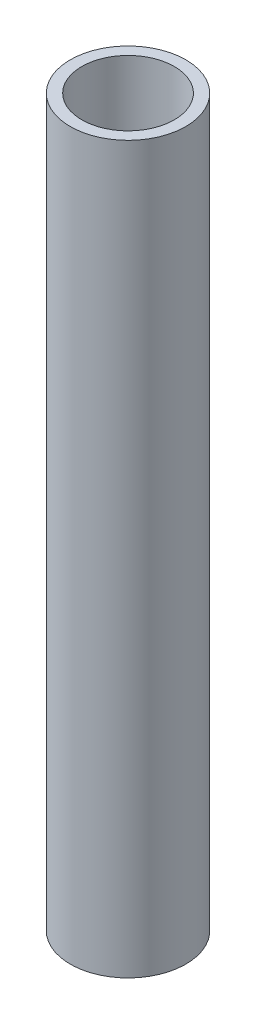
ISO-10303-21;
HEADER;
FILE_DESCRIPTION(('STEP AP214'),'2;1');
FILE_NAME('part.step','',(''),(''),'','','');
FILE_SCHEMA(('AUTOMOTIVE_DESIGN { 1 0 10303 214 1 1 1 1 }'));
ENDSEC;
DATA;
#1=APPLICATION_CONTEXT('core data for automotive mechanical design processes');
#2=APPLICATION_PROTOCOL_DEFINITION('international standard','automotive_design',2000,#1);
#3=PRODUCT_CONTEXT('',#1,'mechanical');
#4=PRODUCT('Part','Part','',(#3));
#5=PRODUCT_RELATED_PRODUCT_CATEGORY('part','',(#4));
#6=PRODUCT_DEFINITION_FORMATION('','',#4);
#7=PRODUCT_DEFINITION_CONTEXT('part definition',#1,'design');
#8=PRODUCT_DEFINITION('design','',#6,#7);
#9=PRODUCT_DEFINITION_SHAPE('','',#8);
#10=(LENGTH_UNIT() NAMED_UNIT(*) SI_UNIT(.MILLI.,.METRE.));
#11=(NAMED_UNIT(*) PLANE_ANGLE_UNIT() SI_UNIT($,.RADIAN.));
#12=(NAMED_UNIT(*) SI_UNIT($,.STERADIAN.) SOLID_ANGLE_UNIT());
#13=UNCERTAINTY_MEASURE_WITH_UNIT(LENGTH_MEASURE(1.E-05),#10,'distance_accuracy_value','');
#14=(GEOMETRIC_REPRESENTATION_CONTEXT(3) GLOBAL_UNCERTAINTY_ASSIGNED_CONTEXT((#13)) GLOBAL_UNIT_ASSIGNED_CONTEXT((#10,
#11,#12)) REPRESENTATION_CONTEXT('',''));
#15=CARTESIAN_POINT('',(0.,0.,0.));
#16=DIRECTION('',(0.,0.,1.));
#17=DIRECTION('',(1.,0.,0.));
#18=AXIS2_PLACEMENT_3D('',#15,#16,#17);
#19=CARTESIAN_POINT('',(0.,188.23,0.));
#20=DIRECTION('',(0.,1.,0.));
#21=DIRECTION('',(0.,0.,1.));
#22=AXIS2_PLACEMENT_3D('',#19,#20,#21);
#23=PLANE('',#22);
#24=CARTESIAN_POINT('',(0.,188.23,0.));
#25=DIRECTION('',(0.,1.,0.));
#26=DIRECTION('',(0.,0.,1.));
#27=AXIS2_PLACEMENT_3D('',#24,#25,#26);
#28=CIRCLE('',#27,15.);
#29=CARTESIAN_POINT('',(0.,188.23,-15.));
#30=VERTEX_POINT('',#29);
#31=EDGE_CURVE('E10',#30,#30,#28,.T.);
#32=ORIENTED_EDGE('',*,*,#31,.T.);
#33=EDGE_LOOP('',(#32));
#34=FACE_BOUND('',#33,.T.);
#35=CARTESIAN_POINT('',(0.,188.23,0.));
#36=DIRECTION('',(0.,1.,0.));
#37=DIRECTION('',(0.,0.,1.));
#38=AXIS2_PLACEMENT_3D('',#35,#36,#37);
#39=CIRCLE('',#38,12.);
#40=CARTESIAN_POINT('',(0.,188.23,-12.));
#41=VERTEX_POINT('',#40);
#42=EDGE_CURVE('E43',#41,#41,#39,.T.);
#43=ORIENTED_EDGE('',*,*,#42,.F.);
#44=EDGE_LOOP('',(#43));
#45=FACE_BOUND('',#44,.T.);
#46=ADVANCED_FACE('F32',(#34,#45),#23,.T.);
#47=CARTESIAN_POINT('',(0.,0.,0.));
#48=DIRECTION('',(0.,1.,0.));
#49=DIRECTION('',(0.,0.,1.));
#50=AXIS2_PLACEMENT_3D('',#47,#48,#49);
#51=PLANE('',#50);
#52=CARTESIAN_POINT('',(0.,0.,0.));
#53=DIRECTION('',(0.,1.,0.));
#54=DIRECTION('',(0.,0.,1.));
#55=AXIS2_PLACEMENT_3D('',#52,#53,#54);
#56=CIRCLE('',#55,15.);
#57=CARTESIAN_POINT('',(0.,0.,-15.));
#58=VERTEX_POINT('',#57);
#59=EDGE_CURVE('E36',#58,#58,#56,.T.);
#60=ORIENTED_EDGE('',*,*,#59,.F.);
#61=EDGE_LOOP('',(#60));
#62=FACE_BOUND('',#61,.T.);
#63=CARTESIAN_POINT('',(0.,0.,0.));
#64=DIRECTION('',(0.,1.,0.));
#65=DIRECTION('',(0.,0.,1.));
#66=AXIS2_PLACEMENT_3D('',#63,#64,#65);
#67=CIRCLE('',#66,12.);
#68=CARTESIAN_POINT('',(0.,0.,-12.));
#69=VERTEX_POINT('',#68);
#70=EDGE_CURVE('E45',#69,#69,#67,.T.);
#71=ORIENTED_EDGE('',*,*,#70,.T.);
#72=EDGE_LOOP('',(#71));
#73=FACE_BOUND('',#72,.T.);
#74=ADVANCED_FACE('F55',(#62,#73),#51,.F.);
#75=CARTESIAN_POINT('',(0.,188.23,0.));
#76=DIRECTION('',(0.,-1.,0.));
#77=DIRECTION('',(0.,0.,-1.));
#78=AXIS2_PLACEMENT_3D('',#75,#76,#77);
#79=CYLINDRICAL_SURFACE('',#78,15.);
#80=CARTESIAN_POINT('',(0.,188.23,-15.));
#81=CARTESIAN_POINT('',(0.,186.269270833333,-15.));
#82=CARTESIAN_POINT('',(0.,184.308541666667,-15.));
#83=CARTESIAN_POINT('',(0.,180.387083333333,-15.));
#84=CARTESIAN_POINT('',(0.,178.426354166667,-15.));
#85=CARTESIAN_POINT('',(0.,174.504895833333,-15.));
#86=CARTESIAN_POINT('',(0.,172.544166666667,-15.));
#87=CARTESIAN_POINT('',(0.,168.622708333333,-15.));
#88=CARTESIAN_POINT('',(0.,166.661979166667,-15.));
#89=CARTESIAN_POINT('',(0.,162.740520833333,-15.));
#90=CARTESIAN_POINT('',(0.,160.779791666667,-15.));
#91=CARTESIAN_POINT('',(0.,156.858333333333,-15.));
#92=CARTESIAN_POINT('',(0.,154.897604166667,-15.));
#93=CARTESIAN_POINT('',(0.,150.976145833333,-15.));
#94=CARTESIAN_POINT('',(0.,149.015416666667,-15.));
#95=CARTESIAN_POINT('',(0.,145.093958333333,-15.));
#96=CARTESIAN_POINT('',(0.,143.133229166667,-15.));
#97=CARTESIAN_POINT('',(0.,139.211770833333,-15.));
#98=CARTESIAN_POINT('',(0.,137.251041666667,-15.));
#99=CARTESIAN_POINT('',(0.,133.329583333333,-15.));
#100=CARTESIAN_POINT('',(0.,131.368854166667,-15.));
#101=CARTESIAN_POINT('',(0.,127.447395833333,-15.));
#102=CARTESIAN_POINT('',(0.,125.486666666667,-15.));
#103=CARTESIAN_POINT('',(0.,121.565208333333,-15.));
#104=CARTESIAN_POINT('',(0.,119.604479166667,-15.));
#105=CARTESIAN_POINT('',(0.,115.683020833333,-15.));
#106=CARTESIAN_POINT('',(0.,113.722291666667,-15.));
#107=CARTESIAN_POINT('',(0.,109.800833333333,-15.));
#108=CARTESIAN_POINT('',(0.,107.840104166667,-15.));
#109=CARTESIAN_POINT('',(0.,103.918645833333,-15.));
#110=CARTESIAN_POINT('',(0.,101.957916666667,-15.));
#111=CARTESIAN_POINT('',(0.,98.0364583333333,-15.));
#112=CARTESIAN_POINT('',(0.,96.0757291666666,-15.));
#113=CARTESIAN_POINT('',(0.,92.1542708333333,-15.));
#114=CARTESIAN_POINT('',(0.,90.1935416666666,-15.));
#115=CARTESIAN_POINT('',(0.,86.2720833333333,-15.));
#116=CARTESIAN_POINT('',(0.,84.3113541666666,-15.));
#117=CARTESIAN_POINT('',(0.,80.3898958333333,-15.));
#118=CARTESIAN_POINT('',(0.,78.4291666666666,-15.));
#119=CARTESIAN_POINT('',(0.,74.5077083333333,-15.));
#120=CARTESIAN_POINT('',(0.,72.5469791666666,-15.));
#121=CARTESIAN_POINT('',(0.,68.6255208333333,-15.));
#122=CARTESIAN_POINT('',(0.,66.6647916666666,-15.));
#123=CARTESIAN_POINT('',(0.,62.7433333333333,-15.));
#124=CARTESIAN_POINT('',(0.,60.7826041666667,-15.));
#125=CARTESIAN_POINT('',(0.,56.8611458333333,-15.));
#126=CARTESIAN_POINT('',(0.,54.9004166666667,-15.));
#127=CARTESIAN_POINT('',(0.,50.9789583333333,-15.));
#128=CARTESIAN_POINT('',(0.,49.0182291666667,-15.));
#129=CARTESIAN_POINT('',(0.,45.0967708333333,-15.));
#130=CARTESIAN_POINT('',(0.,43.1360416666667,-15.));
#131=CARTESIAN_POINT('',(0.,39.2145833333333,-15.));
#132=CARTESIAN_POINT('',(0.,37.2538541666667,-15.));
#133=CARTESIAN_POINT('',(0.,33.3323958333333,-15.));
#134=CARTESIAN_POINT('',(0.,31.3716666666667,-15.));
#135=CARTESIAN_POINT('',(0.,27.4502083333333,-15.));
#136=CARTESIAN_POINT('',(0.,25.4894791666667,-15.));
#137=CARTESIAN_POINT('',(0.,21.5680208333333,-15.));
#138=CARTESIAN_POINT('',(0.,19.6072916666667,-15.));
#139=CARTESIAN_POINT('',(0.,15.6858333333333,-15.));
#140=CARTESIAN_POINT('',(0.,13.7251041666667,-15.));
#141=CARTESIAN_POINT('',(0.,9.80364583333333,-15.));
#142=CARTESIAN_POINT('',(0.,7.84291666666666,-15.));
#143=CARTESIAN_POINT('',(0.,3.92145833333333,-15.));
#144=CARTESIAN_POINT('',(0.,1.96072916666666,-15.));
#145=CARTESIAN_POINT('',(0.,0.,-15.));
#146=B_SPLINE_CURVE_WITH_KNOTS('',3,(#80,#81,#82,#83,#84,#85,#86,#87,#88,#89,#90,#91,#92,#93,
#94,#95,#96,#97,#98,#99,#100,#101,#102,#103,#104,#105,#106,#107,#108,#109,#110,#111,#112,#113,
#114,#115,#116,#117,#118,#119,#120,#121,#122,#123,#124,#125,#126,#127,#128,#129,#130,#131,#132,
#133,#134,#135,#136,#137,#138,#139,#140,#141,#142,#143,#144,#145),.UNSPECIFIED.,.F.,.F.,(4,2,2,
2,2,2,2,2,2,2,2,2,2,2,2,2,2,2,2,2,2,2,2,2,2,2,2,2,2,2,2,2,4),(0.,5.88218750000002,11.764375,
17.6465625,23.52875,29.4109375,35.293125,41.1753125,47.0575,52.9396875,58.821875,64.7040625,
70.58625,76.4684375,82.350625,88.2328125,94.115,99.9971875,105.879375,111.7615625,117.64375,
123.5259375,129.408125,135.2903125,141.1725,147.0546875,152.936875,158.8190625,164.70125,
170.5834375,176.465625,182.3478125,188.23),.UNSPECIFIED.);
#147=EDGE_CURVE('BSEAM34',#30,#58,#146,.T.);
#148=ORIENTED_EDGE('',*,*,#31,.F.);
#149=ORIENTED_EDGE('',*,*,#59,.T.);
#150=ORIENTED_EDGE('',*,*,#147,.T.);
#151=ORIENTED_EDGE('',*,*,#147,.F.);
#152=EDGE_LOOP('',(#148,#150,#149,#151));
#153=FACE_BOUND('',#152,.T.);
#154=ADVANCED_FACE('F34',(#153),#79,.T.);
#155=CARTESIAN_POINT('',(0.,188.23,0.));
#156=DIRECTION('',(0.,-1.,0.));
#157=DIRECTION('',(0.,0.,-1.));
#158=AXIS2_PLACEMENT_3D('',#155,#156,#157);
#159=CYLINDRICAL_SURFACE('',#158,12.);
#160=CARTESIAN_POINT('',(0.,188.23,-12.));
#161=CARTESIAN_POINT('',(0.,186.269270833333,-12.));
#162=CARTESIAN_POINT('',(0.,184.308541666667,-12.));
#163=CARTESIAN_POINT('',(0.,180.387083333333,-12.));
#164=CARTESIAN_POINT('',(0.,178.426354166667,-12.));
#165=CARTESIAN_POINT('',(0.,174.504895833333,-12.));
#166=CARTESIAN_POINT('',(0.,172.544166666667,-12.));
#167=CARTESIAN_POINT('',(0.,168.622708333333,-12.));
#168=CARTESIAN_POINT('',(0.,166.661979166667,-12.));
#169=CARTESIAN_POINT('',(0.,162.740520833333,-12.));
#170=CARTESIAN_POINT('',(0.,160.779791666667,-12.));
#171=CARTESIAN_POINT('',(0.,156.858333333333,-12.));
#172=CARTESIAN_POINT('',(0.,154.897604166667,-12.));
#173=CARTESIAN_POINT('',(0.,150.976145833333,-12.));
#174=CARTESIAN_POINT('',(0.,149.015416666667,-12.));
#175=CARTESIAN_POINT('',(0.,145.093958333333,-12.));
#176=CARTESIAN_POINT('',(0.,143.133229166667,-12.));
#177=CARTESIAN_POINT('',(0.,139.211770833333,-12.));
#178=CARTESIAN_POINT('',(0.,137.251041666667,-12.));
#179=CARTESIAN_POINT('',(0.,133.329583333333,-12.));
#180=CARTESIAN_POINT('',(0.,131.368854166667,-12.));
#181=CARTESIAN_POINT('',(0.,127.447395833333,-12.));
#182=CARTESIAN_POINT('',(0.,125.486666666667,-12.));
#183=CARTESIAN_POINT('',(0.,121.565208333333,-12.));
#184=CARTESIAN_POINT('',(0.,119.604479166667,-12.));
#185=CARTESIAN_POINT('',(0.,115.683020833333,-12.));
#186=CARTESIAN_POINT('',(0.,113.722291666667,-12.));
#187=CARTESIAN_POINT('',(0.,109.800833333333,-12.));
#188=CARTESIAN_POINT('',(0.,107.840104166667,-12.));
#189=CARTESIAN_POINT('',(0.,103.918645833333,-12.));
#190=CARTESIAN_POINT('',(0.,101.957916666667,-12.));
#191=CARTESIAN_POINT('',(0.,98.0364583333333,-12.));
#192=CARTESIAN_POINT('',(0.,96.0757291666666,-12.));
#193=CARTESIAN_POINT('',(0.,92.1542708333333,-12.));
#194=CARTESIAN_POINT('',(0.,90.1935416666667,-12.));
#195=CARTESIAN_POINT('',(0.,86.2720833333333,-12.));
#196=CARTESIAN_POINT('',(0.,84.3113541666667,-12.));
#197=CARTESIAN_POINT('',(0.,80.3898958333333,-12.));
#198=CARTESIAN_POINT('',(0.,78.4291666666667,-12.));
#199=CARTESIAN_POINT('',(0.,74.5077083333333,-12.));
#200=CARTESIAN_POINT('',(0.,72.5469791666666,-12.));
#201=CARTESIAN_POINT('',(0.,68.6255208333333,-12.));
#202=CARTESIAN_POINT('',(0.,66.6647916666667,-12.));
#203=CARTESIAN_POINT('',(0.,62.7433333333333,-12.));
#204=CARTESIAN_POINT('',(0.,60.7826041666667,-12.));
#205=CARTESIAN_POINT('',(0.,56.8611458333333,-12.));
#206=CARTESIAN_POINT('',(0.,54.9004166666667,-12.));
#207=CARTESIAN_POINT('',(0.,50.9789583333333,-12.));
#208=CARTESIAN_POINT('',(0.,49.0182291666667,-12.));
#209=CARTESIAN_POINT('',(0.,45.0967708333333,-12.));
#210=CARTESIAN_POINT('',(0.,43.1360416666667,-12.));
#211=CARTESIAN_POINT('',(0.,39.2145833333333,-12.));
#212=CARTESIAN_POINT('',(0.,37.2538541666667,-12.));
#213=CARTESIAN_POINT('',(0.,33.3323958333333,-12.));
#214=CARTESIAN_POINT('',(0.,31.3716666666667,-12.));
#215=CARTESIAN_POINT('',(0.,27.4502083333333,-12.));
#216=CARTESIAN_POINT('',(0.,25.4894791666667,-12.));
#217=CARTESIAN_POINT('',(0.,21.5680208333333,-12.));
#218=CARTESIAN_POINT('',(0.,19.6072916666667,-12.));
#219=CARTESIAN_POINT('',(0.,15.6858333333333,-12.));
#220=CARTESIAN_POINT('',(0.,13.7251041666667,-12.));
#221=CARTESIAN_POINT('',(0.,9.80364583333333,-12.));
#222=CARTESIAN_POINT('',(0.,7.84291666666666,-12.));
#223=CARTESIAN_POINT('',(0.,3.92145833333333,-12.));
#224=CARTESIAN_POINT('',(0.,1.96072916666666,-12.));
#225=CARTESIAN_POINT('',(0.,0.,-12.));
#226=B_SPLINE_CURVE_WITH_KNOTS('',3,(#160,#161,#162,#163,#164,#165,#166,#167,#168,#169,#170,
#171,#172,#173,#174,#175,#176,#177,#178,#179,#180,#181,#182,#183,#184,#185,#186,#187,#188,#189,
#190,#191,#192,#193,#194,#195,#196,#197,#198,#199,#200,#201,#202,#203,#204,#205,#206,#207,#208,
#209,#210,#211,#212,#213,#214,#215,#216,#217,#218,#219,#220,#221,#222,#223,#224,#225),
.UNSPECIFIED.,.F.,.F.,(4,2,2,2,2,2,2,2,2,2,2,2,2,2,2,2,2,2,2,2,2,2,2,2,2,2,2,2,2,2,2,2,4),(0.,
5.8821875,11.764375,17.6465625,23.52875,29.4109375,35.293125,41.1753125,47.0575,52.9396875,
58.821875,64.7040625,70.58625,76.4684375,82.350625,88.2328125,94.115,99.9971875,105.879375,
111.7615625,117.64375,123.5259375,129.408125,135.2903125,141.1725,147.0546875,152.936875,
158.8190625,164.70125,170.5834375,176.465625,182.3478125,188.23),.UNSPECIFIED.);
#227=EDGE_CURVE('BSEAM51',#41,#69,#226,.T.);
#228=ORIENTED_EDGE('',*,*,#42,.T.);
#229=ORIENTED_EDGE('',*,*,#70,.F.);
#230=ORIENTED_EDGE('',*,*,#227,.T.);
#231=ORIENTED_EDGE('',*,*,#227,.F.);
#232=EDGE_LOOP('',(#228,#230,#229,#231));
#233=FACE_BOUND('',#232,.T.);
#234=ADVANCED_FACE('F51',(#233),#159,.F.);
#235=CLOSED_SHELL('',(#46,#74,#154,#234));
#236=MANIFOLD_SOLID_BREP('B2',#235);
#237=ADVANCED_BREP_SHAPE_REPRESENTATION('',(#18,#236),#14);
#238=SHAPE_DEFINITION_REPRESENTATION(#9,#237);
ENDSEC;
END-ISO-10303-21;
